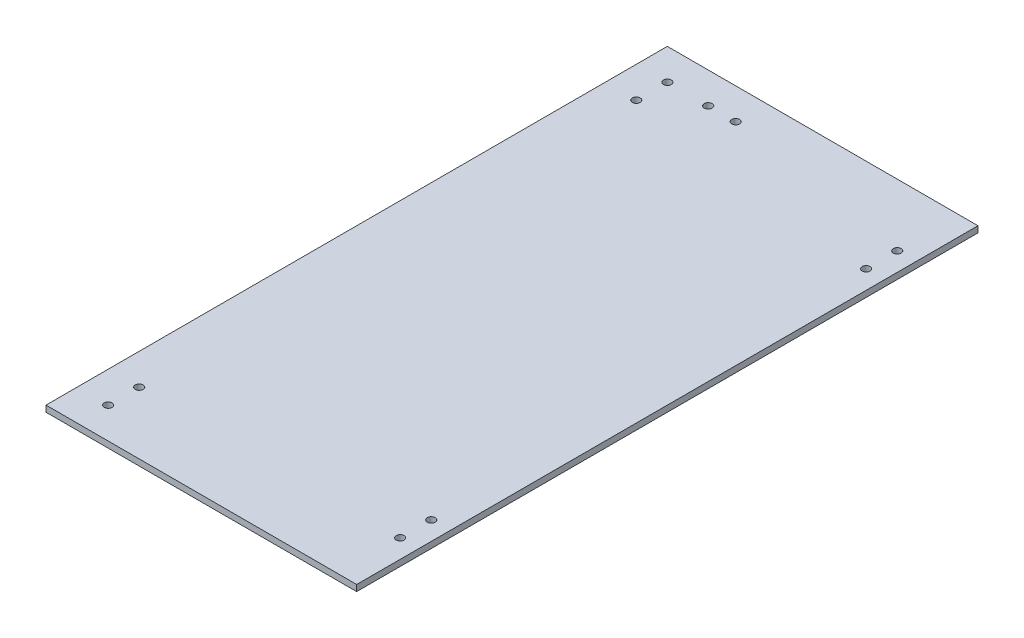
ISO-10303-21;
HEADER;
FILE_DESCRIPTION(('STEP AP214'),'2;1');
FILE_NAME('part.step','',(''),(''),'','','');
FILE_SCHEMA(('AUTOMOTIVE_DESIGN { 1 0 10303 214 1 1 1 1 }'));
ENDSEC;
DATA;
#1=APPLICATION_CONTEXT('core data for automotive mechanical design processes');
#2=APPLICATION_PROTOCOL_DEFINITION('international standard','automotive_design',2000,#1);
#3=PRODUCT_CONTEXT('',#1,'mechanical');
#4=PRODUCT('Part','Part','',(#3));
#5=PRODUCT_RELATED_PRODUCT_CATEGORY('part','',(#4));
#6=PRODUCT_DEFINITION_FORMATION('','',#4);
#7=PRODUCT_DEFINITION_CONTEXT('part definition',#1,'design');
#8=PRODUCT_DEFINITION('design','',#6,#7);
#9=PRODUCT_DEFINITION_SHAPE('','',#8);
#10=(LENGTH_UNIT() NAMED_UNIT(*) SI_UNIT(.MILLI.,.METRE.));
#11=(NAMED_UNIT(*) PLANE_ANGLE_UNIT() SI_UNIT($,.RADIAN.));
#12=(NAMED_UNIT(*) SI_UNIT($,.STERADIAN.) SOLID_ANGLE_UNIT());
#13=UNCERTAINTY_MEASURE_WITH_UNIT(LENGTH_MEASURE(1.E-05),#10,'distance_accuracy_value','');
#14=(GEOMETRIC_REPRESENTATION_CONTEXT(3) GLOBAL_UNCERTAINTY_ASSIGNED_CONTEXT((#13)) GLOBAL_UNIT_ASSIGNED_CONTEXT((#10,
#11,#12)) REPRESENTATION_CONTEXT('',''));
#15=CARTESIAN_POINT('',(0.,0.,0.));
#16=DIRECTION('',(0.,0.,1.));
#17=DIRECTION('',(1.,0.,0.));
#18=AXIS2_PLACEMENT_3D('',#15,#16,#17);
#19=CARTESIAN_POINT('',(0.,5.,-500.));
#20=DIRECTION('',(0.,-1.,0.));
#21=DIRECTION('',(0.,0.,-1.));
#22=AXIS2_PLACEMENT_3D('',#19,#20,#21);
#23=PLANE('',#22);
#24=CARTESIAN_POINT('',(57.902,5.,-475.));
#25=DIRECTION('',(0.,1.,0.));
#26=DIRECTION('',(0.,0.,1.));
#27=AXIS2_PLACEMENT_3D('',#24,#25,#26);
#28=CIRCLE('',#27,3.175);
#29=CARTESIAN_POINT('',(57.902,5.,-471.825));
#30=VERTEX_POINT('',#29);
#31=EDGE_CURVE('E139',#30,#30,#28,.T.);
#32=ORIENTED_EDGE('',*,*,#31,.F.);
#33=EDGE_LOOP('',(#32));
#34=FACE_BOUND('',#33,.T.);
#35=CARTESIAN_POINT('',(80.,5.,-475.));
#36=DIRECTION('',(0.,1.,0.));
#37=DIRECTION('',(0.,0.,1.));
#38=AXIS2_PLACEMENT_3D('',#35,#36,#37);
#39=CIRCLE('',#38,3.175);
#40=CARTESIAN_POINT('',(80.,5.,-471.825));
#41=VERTEX_POINT('',#40);
#42=EDGE_CURVE('E128',#41,#41,#39,.T.);
#43=ORIENTED_EDGE('',*,*,#42,.F.);
#44=EDGE_LOOP('',(#43));
#45=FACE_BOUND('',#44,.T.);
#46=CARTESIAN_POINT('',(235.,5.,-425.));
#47=DIRECTION('',(0.,-1.,0.));
#48=DIRECTION('',(0.,0.,-1.));
#49=AXIS2_PLACEMENT_3D('',#46,#47,#48);
#50=CIRCLE('',#49,3.175);
#51=CARTESIAN_POINT('',(235.,5.,-428.175));
#52=VERTEX_POINT('',#51);
#53=EDGE_CURVE('E159',#52,#52,#50,.F.);
#54=ORIENTED_EDGE('',*,*,#53,.F.);
#55=EDGE_LOOP('',(#54));
#56=FACE_BOUND('',#55,.T.);
#57=CARTESIAN_POINT('',(24.9999999999999,5.,-450.));
#58=DIRECTION('',(0.,1.,0.));
#59=DIRECTION('',(0.,0.,1.));
#60=AXIS2_PLACEMENT_3D('',#57,#58,#59);
#61=CIRCLE('',#60,3.175);
#62=CARTESIAN_POINT('',(24.9999999999999,5.,-446.825));
#63=VERTEX_POINT('',#62);
#64=EDGE_CURVE('E124',#63,#63,#61,.T.);
#65=ORIENTED_EDGE('',*,*,#64,.F.);
#66=EDGE_LOOP('',(#65));
#67=FACE_BOUND('',#66,.T.);
#68=CARTESIAN_POINT('',(25.,5.,-475.));
#69=DIRECTION('',(0.,1.,0.));
#70=DIRECTION('',(0.,0.,1.));
#71=AXIS2_PLACEMENT_3D('',#68,#69,#70);
#72=CIRCLE('',#71,3.175);
#73=CARTESIAN_POINT('',(25.,5.,-471.825));
#74=VERTEX_POINT('',#73);
#75=EDGE_CURVE('E121',#74,#74,#72,.T.);
#76=ORIENTED_EDGE('',*,*,#75,.F.);
#77=EDGE_LOOP('',(#76));
#78=FACE_BOUND('',#77,.T.);
#79=CARTESIAN_POINT('',(25.0000000000001,5.,-50.));
#80=DIRECTION('',(0.,1.,0.));
#81=DIRECTION('',(0.,0.,1.));
#82=AXIS2_PLACEMENT_3D('',#79,#80,#81);
#83=CIRCLE('',#82,3.175);
#84=CARTESIAN_POINT('',(25.0000000000001,5.,-46.825));
#85=VERTEX_POINT('',#84);
#86=EDGE_CURVE('E117',#85,#85,#83,.T.);
#87=ORIENTED_EDGE('',*,*,#86,.F.);
#88=EDGE_LOOP('',(#87));
#89=FACE_BOUND('',#88,.T.);
#90=CARTESIAN_POINT('',(25.,5.,-25.));
#91=DIRECTION('',(0.,1.,0.));
#92=DIRECTION('',(0.,0.,1.));
#93=AXIS2_PLACEMENT_3D('',#90,#91,#92);
#94=CIRCLE('',#93,3.175);
#95=CARTESIAN_POINT('',(25.,5.,-21.825));
#96=VERTEX_POINT('',#95);
#97=EDGE_CURVE('E113',#96,#96,#94,.T.);
#98=ORIENTED_EDGE('',*,*,#97,.F.);
#99=EDGE_LOOP('',(#98));
#100=FACE_BOUND('',#99,.T.);
#101=DIRECTION('',(0.,0.,1.));
#102=VECTOR('',#101,1.);
#103=CARTESIAN_POINT('',(0.,5.,0.));
#104=LINE('',#103,#102);
#105=CARTESIAN_POINT('',(0.,5.,-500.));
#106=VERTEX_POINT('',#105);
#107=CARTESIAN_POINT('',(0.,5.,0.));
#108=VERTEX_POINT('',#107);
#109=EDGE_CURVE('E89',#106,#108,#104,.T.);
#110=ORIENTED_EDGE('',*,*,#109,.T.);
#111=DIRECTION('',(1.,0.,0.));
#112=VECTOR('',#111,1.);
#113=CARTESIAN_POINT('',(0.,5.,0.));
#114=LINE('',#113,#112);
#115=CARTESIAN_POINT('',(250.,5.,0.));
#116=VERTEX_POINT('',#115);
#117=EDGE_CURVE('E84',#108,#116,#114,.T.);
#118=ORIENTED_EDGE('',*,*,#117,.T.);
#119=DIRECTION('',(0.,0.,-1.));
#120=VECTOR('',#119,1.);
#121=CARTESIAN_POINT('',(250.,5.,0.));
#122=LINE('',#121,#120);
#123=CARTESIAN_POINT('',(250.,5.,-500.));
#124=VERTEX_POINT('',#123);
#125=EDGE_CURVE('E87',#116,#124,#122,.T.);
#126=ORIENTED_EDGE('',*,*,#125,.T.);
#127=DIRECTION('',(-1.,0.,0.));
#128=VECTOR('',#127,1.);
#129=CARTESIAN_POINT('',(0.,5.,-500.));
#130=LINE('',#129,#128);
#131=EDGE_CURVE('E54',#124,#106,#130,.T.);
#132=ORIENTED_EDGE('',*,*,#131,.T.);
#133=EDGE_LOOP('',(#110,#118,#126,#132));
#134=FACE_BOUND('',#133,.T.);
#135=CARTESIAN_POINT('',(235.,5.,-50.));
#136=DIRECTION('',(0.,-1.,0.));
#137=DIRECTION('',(0.,0.,-1.));
#138=AXIS2_PLACEMENT_3D('',#135,#136,#137);
#139=CIRCLE('',#138,3.17499999999991);
#140=CARTESIAN_POINT('',(235.,5.,-53.1749999999999));
#141=VERTEX_POINT('',#140);
#142=EDGE_CURVE('E153',#141,#141,#139,.T.);
#143=ORIENTED_EDGE('',*,*,#142,.T.);
#144=EDGE_LOOP('',(#143));
#145=FACE_BOUND('',#144,.T.);
#146=CARTESIAN_POINT('',(235.,5.,-75.));
#147=DIRECTION('',(0.,-1.,0.));
#148=DIRECTION('',(0.,0.,-1.));
#149=AXIS2_PLACEMENT_3D('',#146,#147,#148);
#150=CIRCLE('',#149,3.17499999999991);
#151=CARTESIAN_POINT('',(235.,5.,-78.1749999999999));
#152=VERTEX_POINT('',#151);
#153=EDGE_CURVE('E147',#152,#152,#150,.T.);
#154=ORIENTED_EDGE('',*,*,#153,.T.);
#155=EDGE_LOOP('',(#154));
#156=FACE_BOUND('',#155,.T.);
#157=CARTESIAN_POINT('',(235.,5.,-450.));
#158=DIRECTION('',(0.,-1.,0.));
#159=DIRECTION('',(0.,0.,-1.));
#160=AXIS2_PLACEMENT_3D('',#157,#158,#159);
#161=CIRCLE('',#160,3.17499999999994);
#162=CARTESIAN_POINT('',(235.,5.,-453.175));
#163=VERTEX_POINT('',#162);
#164=EDGE_CURVE('E132',#163,#163,#161,.F.);
#165=ORIENTED_EDGE('',*,*,#164,.F.);
#166=EDGE_LOOP('',(#165));
#167=FACE_BOUND('',#166,.T.);
#168=ADVANCED_FACE('F35',(#34,#45,#56,#67,#78,#89,#100,#134,#145,#156,#167),#23,.F.);
#169=CARTESIAN_POINT('',(0.,0.,-500.));
#170=DIRECTION('',(0.,-1.,0.));
#171=DIRECTION('',(0.,0.,-1.));
#172=AXIS2_PLACEMENT_3D('',#169,#170,#171);
#173=PLANE('',#172);
#174=CARTESIAN_POINT('',(57.902,0.,-475.));
#175=DIRECTION('',(0.,-1.,0.));
#176=DIRECTION('',(0.,0.,-1.));
#177=AXIS2_PLACEMENT_3D('',#174,#175,#176);
#178=CIRCLE('',#177,3.175);
#179=CARTESIAN_POINT('',(57.902,0.,-478.175));
#180=VERTEX_POINT('',#179);
#181=EDGE_CURVE('E39',#180,#180,#178,.T.);
#182=ORIENTED_EDGE('',*,*,#181,.F.);
#183=EDGE_LOOP('',(#182));
#184=FACE_BOUND('',#183,.T.);
#185=CARTESIAN_POINT('',(80.,0.,-475.));
#186=DIRECTION('',(0.,-1.,0.));
#187=DIRECTION('',(0.,0.,-1.));
#188=AXIS2_PLACEMENT_3D('',#185,#186,#187);
#189=CIRCLE('',#188,3.175);
#190=CARTESIAN_POINT('',(80.,0.,-478.175));
#191=VERTEX_POINT('',#190);
#192=EDGE_CURVE('E125',#191,#191,#189,.T.);
#193=ORIENTED_EDGE('',*,*,#192,.F.);
#194=EDGE_LOOP('',(#193));
#195=FACE_BOUND('',#194,.T.);
#196=CARTESIAN_POINT('',(235.,0.,-425.));
#197=DIRECTION('',(0.,-1.,0.));
#198=DIRECTION('',(0.,0.,-1.));
#199=AXIS2_PLACEMENT_3D('',#196,#197,#198);
#200=CIRCLE('',#199,3.175);
#201=CARTESIAN_POINT('',(235.,0.,-428.175));
#202=VERTEX_POINT('',#201);
#203=EDGE_CURVE('E156',#202,#202,#200,.F.);
#204=ORIENTED_EDGE('',*,*,#203,.T.);
#205=EDGE_LOOP('',(#204));
#206=FACE_BOUND('',#205,.T.);
#207=CARTESIAN_POINT('',(24.9999999999999,0.,-450.));
#208=DIRECTION('',(0.,-1.,0.));
#209=DIRECTION('',(0.,0.,-1.));
#210=AXIS2_PLACEMENT_3D('',#207,#208,#209);
#211=CIRCLE('',#210,3.175);
#212=CARTESIAN_POINT('',(24.9999999999999,0.,-453.175));
#213=VERTEX_POINT('',#212);
#214=EDGE_CURVE('E122',#213,#213,#211,.T.);
#215=ORIENTED_EDGE('',*,*,#214,.F.);
#216=EDGE_LOOP('',(#215));
#217=FACE_BOUND('',#216,.T.);
#218=CARTESIAN_POINT('',(25.,0.,-475.));
#219=DIRECTION('',(0.,-1.,0.));
#220=DIRECTION('',(0.,0.,-1.));
#221=AXIS2_PLACEMENT_3D('',#218,#219,#220);
#222=CIRCLE('',#221,3.175);
#223=CARTESIAN_POINT('',(25.,0.,-478.175));
#224=VERTEX_POINT('',#223);
#225=EDGE_CURVE('E118',#224,#224,#222,.T.);
#226=ORIENTED_EDGE('',*,*,#225,.F.);
#227=EDGE_LOOP('',(#226));
#228=FACE_BOUND('',#227,.T.);
#229=CARTESIAN_POINT('',(25.0000000000001,0.,-50.));
#230=DIRECTION('',(0.,-1.,0.));
#231=DIRECTION('',(0.,0.,-1.));
#232=AXIS2_PLACEMENT_3D('',#229,#230,#231);
#233=CIRCLE('',#232,3.175);
#234=CARTESIAN_POINT('',(25.0000000000001,0.,-53.175));
#235=VERTEX_POINT('',#234);
#236=EDGE_CURVE('E114',#235,#235,#233,.T.);
#237=ORIENTED_EDGE('',*,*,#236,.F.);
#238=EDGE_LOOP('',(#237));
#239=FACE_BOUND('',#238,.T.);
#240=CARTESIAN_POINT('',(25.,0.,-25.));
#241=DIRECTION('',(0.,-1.,0.));
#242=DIRECTION('',(0.,0.,-1.));
#243=AXIS2_PLACEMENT_3D('',#240,#241,#242);
#244=CIRCLE('',#243,3.175);
#245=CARTESIAN_POINT('',(25.,0.,-28.175));
#246=VERTEX_POINT('',#245);
#247=EDGE_CURVE('E105',#246,#246,#244,.T.);
#248=ORIENTED_EDGE('',*,*,#247,.F.);
#249=EDGE_LOOP('',(#248));
#250=FACE_BOUND('',#249,.T.);
#251=DIRECTION('',(0.,0.,1.));
#252=VECTOR('',#251,1.);
#253=CARTESIAN_POINT('',(0.,0.,0.));
#254=LINE('',#253,#252);
#255=CARTESIAN_POINT('',(0.,0.,-500.));
#256=VERTEX_POINT('',#255);
#257=CARTESIAN_POINT('',(0.,0.,0.));
#258=VERTEX_POINT('',#257);
#259=EDGE_CURVE('E102',#256,#258,#254,.T.);
#260=ORIENTED_EDGE('',*,*,#259,.F.);
#261=DIRECTION('',(-1.,0.,0.));
#262=VECTOR('',#261,1.);
#263=CARTESIAN_POINT('',(0.,0.,-500.));
#264=LINE('',#263,#262);
#265=CARTESIAN_POINT('',(250.,0.,-500.));
#266=VERTEX_POINT('',#265);
#267=EDGE_CURVE('E77',#266,#256,#264,.T.);
#268=ORIENTED_EDGE('',*,*,#267,.F.);
#269=DIRECTION('',(0.,0.,-1.));
#270=VECTOR('',#269,1.);
#271=CARTESIAN_POINT('',(250.,0.,0.));
#272=LINE('',#271,#270);
#273=CARTESIAN_POINT('',(250.,0.,0.));
#274=VERTEX_POINT('',#273);
#275=EDGE_CURVE('E71',#274,#266,#272,.T.);
#276=ORIENTED_EDGE('',*,*,#275,.F.);
#277=DIRECTION('',(1.,0.,0.));
#278=VECTOR('',#277,1.);
#279=CARTESIAN_POINT('',(0.,0.,0.));
#280=LINE('',#279,#278);
#281=EDGE_CURVE('E93',#258,#274,#280,.T.);
#282=ORIENTED_EDGE('',*,*,#281,.F.);
#283=EDGE_LOOP('',(#260,#268,#276,#282));
#284=FACE_BOUND('',#283,.T.);
#285=CARTESIAN_POINT('',(235.,0.,-50.));
#286=DIRECTION('',(0.,-1.,0.));
#287=DIRECTION('',(0.,0.,-1.));
#288=AXIS2_PLACEMENT_3D('',#285,#286,#287);
#289=CIRCLE('',#288,3.17499999999991);
#290=CARTESIAN_POINT('',(235.,0.,-53.1749999999999));
#291=VERTEX_POINT('',#290);
#292=EDGE_CURVE('E150',#291,#291,#289,.T.);
#293=ORIENTED_EDGE('',*,*,#292,.F.);
#294=EDGE_LOOP('',(#293));
#295=FACE_BOUND('',#294,.T.);
#296=CARTESIAN_POINT('',(235.,0.,-75.));
#297=DIRECTION('',(0.,-1.,0.));
#298=DIRECTION('',(0.,0.,-1.));
#299=AXIS2_PLACEMENT_3D('',#296,#297,#298);
#300=CIRCLE('',#299,3.17499999999991);
#301=CARTESIAN_POINT('',(235.,0.,-78.1749999999999));
#302=VERTEX_POINT('',#301);
#303=EDGE_CURVE('E144',#302,#302,#300,.T.);
#304=ORIENTED_EDGE('',*,*,#303,.F.);
#305=EDGE_LOOP('',(#304));
#306=FACE_BOUND('',#305,.T.);
#307=CARTESIAN_POINT('',(235.,0.,-450.));
#308=DIRECTION('',(0.,1.,0.));
#309=DIRECTION('',(0.,0.,1.));
#310=AXIS2_PLACEMENT_3D('',#307,#308,#309);
#311=CIRCLE('',#310,3.17499999999994);
#312=CARTESIAN_POINT('',(235.,0.,-453.175));
#313=VERTEX_POINT('',#312);
#314=EDGE_CURVE('E127',#313,#313,#311,.T.);
#315=ORIENTED_EDGE('',*,*,#314,.T.);
#316=EDGE_LOOP('',(#315));
#317=FACE_BOUND('',#316,.T.);
#318=ADVANCED_FACE('F174',(#184,#195,#206,#217,#228,#239,#250,#284,#295,#306,#317),#173,.T.);
#319=CARTESIAN_POINT('',(0.,5.,0.));
#320=DIRECTION('',(1.,0.,0.));
#321=DIRECTION('',(0.,0.,-1.));
#322=AXIS2_PLACEMENT_3D('',#319,#320,#321);
#323=PLANE('',#322);
#324=ORIENTED_EDGE('',*,*,#259,.T.);
#325=DIRECTION('',(0.,-1.,0.));
#326=VECTOR('',#325,1.);
#327=CARTESIAN_POINT('',(0.,5.,0.));
#328=LINE('',#327,#326);
#329=EDGE_CURVE('E11',#108,#258,#328,.T.);
#330=ORIENTED_EDGE('',*,*,#329,.F.);
#331=ORIENTED_EDGE('',*,*,#109,.F.);
#332=DIRECTION('',(0.,-1.,0.));
#333=VECTOR('',#332,1.);
#334=CARTESIAN_POINT('',(0.,5.,-500.));
#335=LINE('',#334,#333);
#336=EDGE_CURVE('E98',#106,#256,#335,.T.);
#337=ORIENTED_EDGE('',*,*,#336,.T.);
#338=EDGE_LOOP('',(#324,#330,#331,#337));
#339=FACE_BOUND('',#338,.T.);
#340=ADVANCED_FACE('F37',(#339),#323,.F.);
#341=CARTESIAN_POINT('',(0.,5.,0.));
#342=DIRECTION('',(0.,0.,-1.));
#343=DIRECTION('',(-1.,0.,0.));
#344=AXIS2_PLACEMENT_3D('',#341,#342,#343);
#345=PLANE('',#344);
#346=ORIENTED_EDGE('',*,*,#281,.T.);
#347=DIRECTION('',(0.,-1.,0.));
#348=VECTOR('',#347,1.);
#349=CARTESIAN_POINT('',(250.,5.,0.));
#350=LINE('',#349,#348);
#351=EDGE_CURVE('E45',#116,#274,#350,.T.);
#352=ORIENTED_EDGE('',*,*,#351,.F.);
#353=ORIENTED_EDGE('',*,*,#117,.F.);
#354=ORIENTED_EDGE('',*,*,#329,.T.);
#355=EDGE_LOOP('',(#346,#352,#353,#354));
#356=FACE_BOUND('',#355,.T.);
#357=ADVANCED_FACE('F92',(#356),#345,.F.);
#358=CARTESIAN_POINT('',(250.,5.,0.));
#359=DIRECTION('',(-1.,0.,0.));
#360=DIRECTION('',(0.,0.,1.));
#361=AXIS2_PLACEMENT_3D('',#358,#359,#360);
#362=PLANE('',#361);
#363=ORIENTED_EDGE('',*,*,#275,.T.);
#364=DIRECTION('',(0.,-1.,0.));
#365=VECTOR('',#364,1.);
#366=CARTESIAN_POINT('',(250.,5.,-500.));
#367=LINE('',#366,#365);
#368=EDGE_CURVE('E94',#124,#266,#367,.T.);
#369=ORIENTED_EDGE('',*,*,#368,.F.);
#370=ORIENTED_EDGE('',*,*,#125,.F.);
#371=ORIENTED_EDGE('',*,*,#351,.T.);
#372=EDGE_LOOP('',(#363,#369,#370,#371));
#373=FACE_BOUND('',#372,.T.);
#374=ADVANCED_FACE('F96',(#373),#362,.F.);
#375=CARTESIAN_POINT('',(0.,5.,-500.));
#376=DIRECTION('',(0.,0.,1.));
#377=DIRECTION('',(1.,0.,0.));
#378=AXIS2_PLACEMENT_3D('',#375,#376,#377);
#379=PLANE('',#378);
#380=ORIENTED_EDGE('',*,*,#267,.T.);
#381=ORIENTED_EDGE('',*,*,#336,.F.);
#382=ORIENTED_EDGE('',*,*,#131,.F.);
#383=ORIENTED_EDGE('',*,*,#368,.T.);
#384=EDGE_LOOP('',(#380,#381,#382,#383));
#385=FACE_BOUND('',#384,.T.);
#386=ADVANCED_FACE('F188',(#385),#379,.F.);
#387=CARTESIAN_POINT('',(25.,-5.,-25.));
#388=DIRECTION('',(0.,1.,0.));
#389=DIRECTION('',(0.,0.,1.));
#390=AXIS2_PLACEMENT_3D('',#387,#388,#389);
#391=CYLINDRICAL_SURFACE('',#390,3.175);
#392=ORIENTED_EDGE('',*,*,#247,.T.);
#393=EDGE_LOOP('',(#392));
#394=FACE_BOUND('',#393,.T.);
#395=ORIENTED_EDGE('',*,*,#97,.T.);
#396=EDGE_LOOP('',(#395));
#397=FACE_BOUND('',#396,.T.);
#398=ADVANCED_FACE('F171',(#394,#397),#391,.F.);
#399=CARTESIAN_POINT('',(25.0000000000001,-5.,-50.));
#400=DIRECTION('',(0.,1.,0.));
#401=DIRECTION('',(0.,0.,1.));
#402=AXIS2_PLACEMENT_3D('',#399,#400,#401);
#403=CYLINDRICAL_SURFACE('',#402,3.175);
#404=ORIENTED_EDGE('',*,*,#236,.T.);
#405=EDGE_LOOP('',(#404));
#406=FACE_BOUND('',#405,.T.);
#407=ORIENTED_EDGE('',*,*,#86,.T.);
#408=EDGE_LOOP('',(#407));
#409=FACE_BOUND('',#408,.T.);
#410=ADVANCED_FACE('F240',(#406,#409),#403,.F.);
#411=CARTESIAN_POINT('',(25.,-5.,-475.));
#412=DIRECTION('',(0.,1.,0.));
#413=DIRECTION('',(0.,0.,1.));
#414=AXIS2_PLACEMENT_3D('',#411,#412,#413);
#415=CYLINDRICAL_SURFACE('',#414,3.175);
#416=ORIENTED_EDGE('',*,*,#225,.T.);
#417=EDGE_LOOP('',(#416));
#418=FACE_BOUND('',#417,.T.);
#419=ORIENTED_EDGE('',*,*,#75,.T.);
#420=EDGE_LOOP('',(#419));
#421=FACE_BOUND('',#420,.T.);
#422=ADVANCED_FACE('F237',(#418,#421),#415,.F.);
#423=CARTESIAN_POINT('',(24.9999999999999,-5.,-450.));
#424=DIRECTION('',(0.,1.,0.));
#425=DIRECTION('',(0.,0.,1.));
#426=AXIS2_PLACEMENT_3D('',#423,#424,#425);
#427=CYLINDRICAL_SURFACE('',#426,3.175);
#428=ORIENTED_EDGE('',*,*,#214,.T.);
#429=EDGE_LOOP('',(#428));
#430=FACE_BOUND('',#429,.T.);
#431=ORIENTED_EDGE('',*,*,#64,.T.);
#432=EDGE_LOOP('',(#431));
#433=FACE_BOUND('',#432,.T.);
#434=ADVANCED_FACE('F233',(#430,#433),#427,.F.);
#435=CARTESIAN_POINT('',(235.,9.99999999999999,-425.));
#436=DIRECTION('',(0.,-1.,0.));
#437=DIRECTION('',(0.,0.,-1.));
#438=AXIS2_PLACEMENT_3D('',#435,#436,#437);
#439=CYLINDRICAL_SURFACE('',#438,3.175);
#440=CARTESIAN_POINT('',(235.,0.,-428.175));
#441=CARTESIAN_POINT('',(235.,0.0520833333333351,-428.175));
#442=CARTESIAN_POINT('',(235.,0.104166666666669,-428.175));
#443=CARTESIAN_POINT('',(235.,0.208333333333335,-428.175));
#444=CARTESIAN_POINT('',(235.,0.260416666666669,-428.175));
#445=CARTESIAN_POINT('',(235.,0.364583333333335,-428.175));
#446=CARTESIAN_POINT('',(235.,0.416666666666669,-428.175));
#447=CARTESIAN_POINT('',(235.,0.520833333333335,-428.175));
#448=CARTESIAN_POINT('',(235.,0.572916666666669,-428.175));
#449=CARTESIAN_POINT('',(235.,0.677083333333336,-428.175));
#450=CARTESIAN_POINT('',(235.,0.729166666666669,-428.175));
#451=CARTESIAN_POINT('',(235.,0.833333333333335,-428.175));
#452=CARTESIAN_POINT('',(235.,0.885416666666668,-428.175));
#453=CARTESIAN_POINT('',(235.,0.989583333333334,-428.175));
#454=CARTESIAN_POINT('',(235.,1.04166666666667,-428.175));
#455=CARTESIAN_POINT('',(235.,1.14583333333333,-428.175));
#456=CARTESIAN_POINT('',(235.,1.19791666666667,-428.175));
#457=CARTESIAN_POINT('',(235.,1.30208333333333,-428.175));
#458=CARTESIAN_POINT('',(235.,1.35416666666667,-428.175));
#459=CARTESIAN_POINT('',(235.,1.45833333333333,-428.175));
#460=CARTESIAN_POINT('',(235.,1.51041666666667,-428.175));
#461=CARTESIAN_POINT('',(235.,1.61458333333333,-428.175));
#462=CARTESIAN_POINT('',(235.,1.66666666666667,-428.175));
#463=CARTESIAN_POINT('',(235.,1.77083333333334,-428.175));
#464=CARTESIAN_POINT('',(235.,1.82291666666667,-428.175));
#465=CARTESIAN_POINT('',(235.,1.92708333333334,-428.175));
#466=CARTESIAN_POINT('',(235.,1.97916666666667,-428.175));
#467=CARTESIAN_POINT('',(235.,2.08333333333334,-428.175));
#468=CARTESIAN_POINT('',(235.,2.13541666666667,-428.175));
#469=CARTESIAN_POINT('',(235.,2.23958333333333,-428.175));
#470=CARTESIAN_POINT('',(235.,2.29166666666667,-428.175));
#471=CARTESIAN_POINT('',(235.,2.39583333333333,-428.175));
#472=CARTESIAN_POINT('',(235.,2.44791666666667,-428.175));
#473=CARTESIAN_POINT('',(235.,2.55208333333333,-428.175));
#474=CARTESIAN_POINT('',(235.,2.60416666666667,-428.175));
#475=CARTESIAN_POINT('',(235.,2.70833333333333,-428.175));
#476=CARTESIAN_POINT('',(235.,2.76041666666667,-428.175));
#477=CARTESIAN_POINT('',(235.,2.86458333333333,-428.175));
#478=CARTESIAN_POINT('',(235.,2.91666666666667,-428.175));
#479=CARTESIAN_POINT('',(235.,3.02083333333333,-428.175));
#480=CARTESIAN_POINT('',(235.,3.07291666666667,-428.175));
#481=CARTESIAN_POINT('',(235.,3.17708333333333,-428.175));
#482=CARTESIAN_POINT('',(235.,3.22916666666667,-428.175));
#483=CARTESIAN_POINT('',(235.,3.33333333333333,-428.175));
#484=CARTESIAN_POINT('',(235.,3.38541666666667,-428.175));
#485=CARTESIAN_POINT('',(235.,3.48958333333333,-428.175));
#486=CARTESIAN_POINT('',(235.,3.54166666666667,-428.175));
#487=CARTESIAN_POINT('',(235.,3.64583333333333,-428.175));
#488=CARTESIAN_POINT('',(235.,3.69791666666667,-428.175));
#489=CARTESIAN_POINT('',(235.,3.80208333333333,-428.175));
#490=CARTESIAN_POINT('',(235.,3.85416666666667,-428.175));
#491=CARTESIAN_POINT('',(235.,3.95833333333333,-428.175));
#492=CARTESIAN_POINT('',(235.,4.01041666666667,-428.175));
#493=CARTESIAN_POINT('',(235.,4.11458333333333,-428.175));
#494=CARTESIAN_POINT('',(235.,4.16666666666667,-428.175));
#495=CARTESIAN_POINT('',(235.,4.27083333333333,-428.175));
#496=CARTESIAN_POINT('',(235.,4.32291666666667,-428.175));
#497=CARTESIAN_POINT('',(235.,4.42708333333333,-428.175));
#498=CARTESIAN_POINT('',(235.,4.47916666666667,-428.175));
#499=CARTESIAN_POINT('',(235.,4.58333333333333,-428.175));
#500=CARTESIAN_POINT('',(235.,4.63541666666667,-428.175));
#501=CARTESIAN_POINT('',(235.,4.73958333333333,-428.175));
#502=CARTESIAN_POINT('',(235.,4.79166666666667,-428.175));
#503=CARTESIAN_POINT('',(235.,4.89583333333333,-428.175));
#504=CARTESIAN_POINT('',(235.,4.94791666666667,-428.175));
#505=CARTESIAN_POINT('',(235.,5.,-428.175));
#506=B_SPLINE_CURVE_WITH_KNOTS('',3,(#440,#441,#442,#443,#444,#445,#446,#447,#448,#449,#450,
#451,#452,#453,#454,#455,#456,#457,#458,#459,#460,#461,#462,#463,#464,#465,#466,#467,#468,#469,
#470,#471,#472,#473,#474,#475,#476,#477,#478,#479,#480,#481,#482,#483,#484,#485,#486,#487,#488,
#489,#490,#491,#492,#493,#494,#495,#496,#497,#498,#499,#500,#501,#502,#503,#504,#505),
.UNSPECIFIED.,.F.,.F.,(4,2,2,2,2,2,2,2,2,2,2,2,2,2,2,2,2,2,2,2,2,2,2,2,2,2,2,2,2,2,2,2,4),(0.,
0.15625,0.3125,0.46875,0.625000000000001,0.781250000000001,0.937499999999999,1.09375,1.25,
1.40625,1.5625,1.71875,1.875,2.03125,2.1875,2.34375,2.5,2.65625,2.8125,2.96875,3.125,3.28125,
3.4375,3.59375,3.75,3.90625,4.0625,4.21875,4.375,4.53125,4.6875,4.84375,5.),.UNSPECIFIED.);
#507=EDGE_CURVE('BSEAM229',#202,#52,#506,.T.);
#508=ORIENTED_EDGE('',*,*,#203,.F.);
#509=ORIENTED_EDGE('',*,*,#53,.T.);
#510=ORIENTED_EDGE('',*,*,#507,.T.);
#511=ORIENTED_EDGE('',*,*,#507,.F.);
#512=EDGE_LOOP('',(#508,#510,#509,#511));
#513=FACE_BOUND('',#512,.T.);
#514=ADVANCED_FACE('F229',(#513),#439,.F.);
#515=CARTESIAN_POINT('',(235.,9.99999999999999,-50.));
#516=DIRECTION('',(0.,-1.,0.));
#517=DIRECTION('',(0.,0.,-1.));
#518=AXIS2_PLACEMENT_3D('',#515,#516,#517);
#519=CYLINDRICAL_SURFACE('',#518,3.17499999999991);
#520=CARTESIAN_POINT('',(235.,0.,-53.1749999999999));
#521=CARTESIAN_POINT('',(235.,0.0520833333333351,-53.1749999999999));
#522=CARTESIAN_POINT('',(235.,0.104166666666669,-53.1749999999999));
#523=CARTESIAN_POINT('',(235.,0.208333333333335,-53.1749999999999));
#524=CARTESIAN_POINT('',(235.,0.260416666666669,-53.1749999999999));
#525=CARTESIAN_POINT('',(235.,0.364583333333335,-53.1749999999999));
#526=CARTESIAN_POINT('',(235.,0.416666666666669,-53.1749999999999));
#527=CARTESIAN_POINT('',(235.,0.520833333333335,-53.1749999999999));
#528=CARTESIAN_POINT('',(235.,0.572916666666669,-53.1749999999999));
#529=CARTESIAN_POINT('',(235.,0.677083333333336,-53.1749999999999));
#530=CARTESIAN_POINT('',(235.,0.729166666666669,-53.1749999999999));
#531=CARTESIAN_POINT('',(235.,0.833333333333335,-53.1749999999999));
#532=CARTESIAN_POINT('',(235.,0.885416666666668,-53.1749999999999));
#533=CARTESIAN_POINT('',(235.,0.989583333333334,-53.1749999999999));
#534=CARTESIAN_POINT('',(235.,1.04166666666667,-53.1749999999999));
#535=CARTESIAN_POINT('',(235.,1.14583333333333,-53.1749999999999));
#536=CARTESIAN_POINT('',(235.,1.19791666666667,-53.1749999999999));
#537=CARTESIAN_POINT('',(235.,1.30208333333333,-53.1749999999999));
#538=CARTESIAN_POINT('',(235.,1.35416666666667,-53.1749999999999));
#539=CARTESIAN_POINT('',(235.,1.45833333333333,-53.1749999999999));
#540=CARTESIAN_POINT('',(235.,1.51041666666667,-53.1749999999999));
#541=CARTESIAN_POINT('',(235.,1.61458333333333,-53.1749999999999));
#542=CARTESIAN_POINT('',(235.,1.66666666666667,-53.1749999999999));
#543=CARTESIAN_POINT('',(235.,1.77083333333334,-53.1749999999999));
#544=CARTESIAN_POINT('',(235.,1.82291666666667,-53.1749999999999));
#545=CARTESIAN_POINT('',(235.,1.92708333333334,-53.1749999999999));
#546=CARTESIAN_POINT('',(235.,1.97916666666667,-53.1749999999999));
#547=CARTESIAN_POINT('',(235.,2.08333333333334,-53.1749999999999));
#548=CARTESIAN_POINT('',(235.,2.13541666666667,-53.1749999999999));
#549=CARTESIAN_POINT('',(235.,2.23958333333333,-53.1749999999999));
#550=CARTESIAN_POINT('',(235.,2.29166666666667,-53.1749999999999));
#551=CARTESIAN_POINT('',(235.,2.39583333333333,-53.1749999999999));
#552=CARTESIAN_POINT('',(235.,2.44791666666667,-53.1749999999999));
#553=CARTESIAN_POINT('',(235.,2.55208333333333,-53.1749999999999));
#554=CARTESIAN_POINT('',(235.,2.60416666666667,-53.1749999999999));
#555=CARTESIAN_POINT('',(235.,2.70833333333333,-53.1749999999999));
#556=CARTESIAN_POINT('',(235.,2.76041666666667,-53.1749999999999));
#557=CARTESIAN_POINT('',(235.,2.86458333333333,-53.1749999999999));
#558=CARTESIAN_POINT('',(235.,2.91666666666667,-53.1749999999999));
#559=CARTESIAN_POINT('',(235.,3.02083333333333,-53.1749999999999));
#560=CARTESIAN_POINT('',(235.,3.07291666666667,-53.1749999999999));
#561=CARTESIAN_POINT('',(235.,3.17708333333333,-53.1749999999999));
#562=CARTESIAN_POINT('',(235.,3.22916666666667,-53.1749999999999));
#563=CARTESIAN_POINT('',(235.,3.33333333333333,-53.1749999999999));
#564=CARTESIAN_POINT('',(235.,3.38541666666667,-53.1749999999999));
#565=CARTESIAN_POINT('',(235.,3.48958333333333,-53.1749999999999));
#566=CARTESIAN_POINT('',(235.,3.54166666666667,-53.1749999999999));
#567=CARTESIAN_POINT('',(235.,3.64583333333333,-53.1749999999999));
#568=CARTESIAN_POINT('',(235.,3.69791666666667,-53.1749999999999));
#569=CARTESIAN_POINT('',(235.,3.80208333333333,-53.1749999999999));
#570=CARTESIAN_POINT('',(235.,3.85416666666667,-53.1749999999999));
#571=CARTESIAN_POINT('',(235.,3.95833333333333,-53.1749999999999));
#572=CARTESIAN_POINT('',(235.,4.01041666666667,-53.1749999999999));
#573=CARTESIAN_POINT('',(235.,4.11458333333333,-53.1749999999999));
#574=CARTESIAN_POINT('',(235.,4.16666666666667,-53.1749999999999));
#575=CARTESIAN_POINT('',(235.,4.27083333333333,-53.1749999999999));
#576=CARTESIAN_POINT('',(235.,4.32291666666667,-53.1749999999999));
#577=CARTESIAN_POINT('',(235.,4.42708333333333,-53.1749999999999));
#578=CARTESIAN_POINT('',(235.,4.47916666666667,-53.1749999999999));
#579=CARTESIAN_POINT('',(235.,4.58333333333333,-53.1749999999999));
#580=CARTESIAN_POINT('',(235.,4.63541666666667,-53.1749999999999));
#581=CARTESIAN_POINT('',(235.,4.73958333333333,-53.1749999999999));
#582=CARTESIAN_POINT('',(235.,4.79166666666667,-53.1749999999999));
#583=CARTESIAN_POINT('',(235.,4.89583333333333,-53.1749999999999));
#584=CARTESIAN_POINT('',(235.,4.94791666666667,-53.1749999999999));
#585=CARTESIAN_POINT('',(235.,5.,-53.1749999999999));
#586=B_SPLINE_CURVE_WITH_KNOTS('',3,(#520,#521,#522,#523,#524,#525,#526,#527,#528,#529,#530,
#531,#532,#533,#534,#535,#536,#537,#538,#539,#540,#541,#542,#543,#544,#545,#546,#547,#548,#549,
#550,#551,#552,#553,#554,#555,#556,#557,#558,#559,#560,#561,#562,#563,#564,#565,#566,#567,#568,
#569,#570,#571,#572,#573,#574,#575,#576,#577,#578,#579,#580,#581,#582,#583,#584,#585),
.UNSPECIFIED.,.F.,.F.,(4,2,2,2,2,2,2,2,2,2,2,2,2,2,2,2,2,2,2,2,2,2,2,2,2,2,2,2,2,2,2,2,4),(0.,
0.15625,0.3125,0.46875,0.625000000000001,0.781250000000001,0.937499999999999,1.09375,1.25,
1.40625,1.5625,1.71875,1.875,2.03125,2.1875,2.34375,2.5,2.65625,2.8125,2.96875,3.125,3.28125,
3.4375,3.59375,3.75,3.90625,4.0625,4.21875,4.375,4.53125,4.6875,4.84375,5.),.UNSPECIFIED.);
#587=EDGE_CURVE('BSEAM222',#291,#141,#586,.T.);
#588=ORIENTED_EDGE('',*,*,#292,.T.);
#589=ORIENTED_EDGE('',*,*,#142,.F.);
#590=ORIENTED_EDGE('',*,*,#587,.T.);
#591=ORIENTED_EDGE('',*,*,#587,.F.);
#592=EDGE_LOOP('',(#588,#590,#589,#591));
#593=FACE_BOUND('',#592,.T.);
#594=ADVANCED_FACE('F222',(#593),#519,.F.);
#595=CARTESIAN_POINT('',(235.,9.99999999999999,-75.));
#596=DIRECTION('',(0.,-1.,0.));
#597=DIRECTION('',(0.,0.,-1.));
#598=AXIS2_PLACEMENT_3D('',#595,#596,#597);
#599=CYLINDRICAL_SURFACE('',#598,3.17499999999991);
#600=CARTESIAN_POINT('',(235.,0.,-78.1749999999999));
#601=CARTESIAN_POINT('',(235.,0.0520833333333351,-78.1749999999999));
#602=CARTESIAN_POINT('',(235.,0.104166666666669,-78.1749999999999));
#603=CARTESIAN_POINT('',(235.,0.208333333333335,-78.1749999999999));
#604=CARTESIAN_POINT('',(235.,0.260416666666669,-78.1749999999999));
#605=CARTESIAN_POINT('',(235.,0.364583333333335,-78.1749999999999));
#606=CARTESIAN_POINT('',(235.,0.416666666666669,-78.1749999999999));
#607=CARTESIAN_POINT('',(235.,0.520833333333335,-78.1749999999999));
#608=CARTESIAN_POINT('',(235.,0.572916666666669,-78.1749999999999));
#609=CARTESIAN_POINT('',(235.,0.677083333333336,-78.1749999999999));
#610=CARTESIAN_POINT('',(235.,0.729166666666669,-78.1749999999999));
#611=CARTESIAN_POINT('',(235.,0.833333333333335,-78.1749999999999));
#612=CARTESIAN_POINT('',(235.,0.885416666666668,-78.1749999999999));
#613=CARTESIAN_POINT('',(235.,0.989583333333334,-78.1749999999999));
#614=CARTESIAN_POINT('',(235.,1.04166666666667,-78.1749999999999));
#615=CARTESIAN_POINT('',(235.,1.14583333333333,-78.1749999999999));
#616=CARTESIAN_POINT('',(235.,1.19791666666667,-78.1749999999999));
#617=CARTESIAN_POINT('',(235.,1.30208333333333,-78.1749999999999));
#618=CARTESIAN_POINT('',(235.,1.35416666666667,-78.1749999999999));
#619=CARTESIAN_POINT('',(235.,1.45833333333333,-78.1749999999999));
#620=CARTESIAN_POINT('',(235.,1.51041666666667,-78.1749999999999));
#621=CARTESIAN_POINT('',(235.,1.61458333333333,-78.1749999999999));
#622=CARTESIAN_POINT('',(235.,1.66666666666667,-78.1749999999999));
#623=CARTESIAN_POINT('',(235.,1.77083333333334,-78.1749999999999));
#624=CARTESIAN_POINT('',(235.,1.82291666666667,-78.1749999999999));
#625=CARTESIAN_POINT('',(235.,1.92708333333334,-78.1749999999999));
#626=CARTESIAN_POINT('',(235.,1.97916666666667,-78.1749999999999));
#627=CARTESIAN_POINT('',(235.,2.08333333333334,-78.1749999999999));
#628=CARTESIAN_POINT('',(235.,2.13541666666667,-78.1749999999999));
#629=CARTESIAN_POINT('',(235.,2.23958333333333,-78.1749999999999));
#630=CARTESIAN_POINT('',(235.,2.29166666666667,-78.1749999999999));
#631=CARTESIAN_POINT('',(235.,2.39583333333333,-78.1749999999999));
#632=CARTESIAN_POINT('',(235.,2.44791666666667,-78.1749999999999));
#633=CARTESIAN_POINT('',(235.,2.55208333333333,-78.1749999999999));
#634=CARTESIAN_POINT('',(235.,2.60416666666667,-78.1749999999999));
#635=CARTESIAN_POINT('',(235.,2.70833333333333,-78.1749999999999));
#636=CARTESIAN_POINT('',(235.,2.76041666666667,-78.1749999999999));
#637=CARTESIAN_POINT('',(235.,2.86458333333333,-78.1749999999999));
#638=CARTESIAN_POINT('',(235.,2.91666666666667,-78.1749999999999));
#639=CARTESIAN_POINT('',(235.,3.02083333333333,-78.1749999999999));
#640=CARTESIAN_POINT('',(235.,3.07291666666667,-78.1749999999999));
#641=CARTESIAN_POINT('',(235.,3.17708333333333,-78.1749999999999));
#642=CARTESIAN_POINT('',(235.,3.22916666666667,-78.1749999999999));
#643=CARTESIAN_POINT('',(235.,3.33333333333333,-78.1749999999999));
#644=CARTESIAN_POINT('',(235.,3.38541666666667,-78.1749999999999));
#645=CARTESIAN_POINT('',(235.,3.48958333333333,-78.1749999999999));
#646=CARTESIAN_POINT('',(235.,3.54166666666667,-78.1749999999999));
#647=CARTESIAN_POINT('',(235.,3.64583333333333,-78.1749999999999));
#648=CARTESIAN_POINT('',(235.,3.69791666666667,-78.1749999999999));
#649=CARTESIAN_POINT('',(235.,3.80208333333333,-78.1749999999999));
#650=CARTESIAN_POINT('',(235.,3.85416666666667,-78.1749999999999));
#651=CARTESIAN_POINT('',(235.,3.95833333333333,-78.1749999999999));
#652=CARTESIAN_POINT('',(235.,4.01041666666667,-78.1749999999999));
#653=CARTESIAN_POINT('',(235.,4.11458333333333,-78.1749999999999));
#654=CARTESIAN_POINT('',(235.,4.16666666666667,-78.1749999999999));
#655=CARTESIAN_POINT('',(235.,4.27083333333333,-78.1749999999999));
#656=CARTESIAN_POINT('',(235.,4.32291666666667,-78.1749999999999));
#657=CARTESIAN_POINT('',(235.,4.42708333333333,-78.1749999999999));
#658=CARTESIAN_POINT('',(235.,4.47916666666667,-78.1749999999999));
#659=CARTESIAN_POINT('',(235.,4.58333333333333,-78.1749999999999));
#660=CARTESIAN_POINT('',(235.,4.63541666666667,-78.1749999999999));
#661=CARTESIAN_POINT('',(235.,4.73958333333333,-78.1749999999999));
#662=CARTESIAN_POINT('',(235.,4.79166666666667,-78.1749999999999));
#663=CARTESIAN_POINT('',(235.,4.89583333333333,-78.1749999999999));
#664=CARTESIAN_POINT('',(235.,4.94791666666667,-78.1749999999999));
#665=CARTESIAN_POINT('',(235.,5.,-78.1749999999999));
#666=B_SPLINE_CURVE_WITH_KNOTS('',3,(#600,#601,#602,#603,#604,#605,#606,#607,#608,#609,#610,
#611,#612,#613,#614,#615,#616,#617,#618,#619,#620,#621,#622,#623,#624,#625,#626,#627,#628,#629,
#630,#631,#632,#633,#634,#635,#636,#637,#638,#639,#640,#641,#642,#643,#644,#645,#646,#647,#648,
#649,#650,#651,#652,#653,#654,#655,#656,#657,#658,#659,#660,#661,#662,#663,#664,#665),
.UNSPECIFIED.,.F.,.F.,(4,2,2,2,2,2,2,2,2,2,2,2,2,2,2,2,2,2,2,2,2,2,2,2,2,2,2,2,2,2,2,2,4),(0.,
0.15625,0.3125,0.46875,0.625000000000001,0.781250000000001,0.937499999999999,1.09375,1.25,
1.40625,1.5625,1.71875,1.875,2.03125,2.1875,2.34375,2.5,2.65625,2.8125,2.96875,3.125,3.28125,
3.4375,3.59375,3.75,3.90625,4.0625,4.21875,4.375,4.53125,4.6875,4.84375,5.),.UNSPECIFIED.);
#667=EDGE_CURVE('BSEAM213',#302,#152,#666,.T.);
#668=ORIENTED_EDGE('',*,*,#303,.T.);
#669=ORIENTED_EDGE('',*,*,#153,.F.);
#670=ORIENTED_EDGE('',*,*,#667,.T.);
#671=ORIENTED_EDGE('',*,*,#667,.F.);
#672=EDGE_LOOP('',(#668,#670,#669,#671));
#673=FACE_BOUND('',#672,.T.);
#674=ADVANCED_FACE('F213',(#673),#599,.F.);
#675=CARTESIAN_POINT('',(235.,9.99999999999999,-450.));
#676=DIRECTION('',(0.,-1.,0.));
#677=DIRECTION('',(0.,0.,-1.));
#678=AXIS2_PLACEMENT_3D('',#675,#676,#677);
#679=CYLINDRICAL_SURFACE('',#678,3.17499999999994);
#680=CARTESIAN_POINT('',(235.,0.,-453.175));
#681=CARTESIAN_POINT('',(235.,0.0520833333333316,-453.175));
#682=CARTESIAN_POINT('',(235.,0.104166666666665,-453.175));
#683=CARTESIAN_POINT('',(235.,0.208333333333332,-453.175));
#684=CARTESIAN_POINT('',(235.,0.260416666666665,-453.175));
#685=CARTESIAN_POINT('',(235.,0.364583333333332,-453.175));
#686=CARTESIAN_POINT('',(235.,0.416666666666665,-453.175));
#687=CARTESIAN_POINT('',(235.,0.520833333333332,-453.175));
#688=CARTESIAN_POINT('',(235.,0.572916666666666,-453.175));
#689=CARTESIAN_POINT('',(235.,0.677083333333332,-453.175));
#690=CARTESIAN_POINT('',(235.,0.729166666666666,-453.175));
#691=CARTESIAN_POINT('',(235.,0.833333333333332,-453.175));
#692=CARTESIAN_POINT('',(235.,0.885416666666666,-453.175));
#693=CARTESIAN_POINT('',(235.,0.989583333333333,-453.175));
#694=CARTESIAN_POINT('',(235.,1.04166666666667,-453.175));
#695=CARTESIAN_POINT('',(235.,1.14583333333333,-453.175));
#696=CARTESIAN_POINT('',(235.,1.19791666666667,-453.175));
#697=CARTESIAN_POINT('',(235.,1.30208333333333,-453.175));
#698=CARTESIAN_POINT('',(235.,1.35416666666667,-453.175));
#699=CARTESIAN_POINT('',(235.,1.45833333333333,-453.175));
#700=CARTESIAN_POINT('',(235.,1.51041666666667,-453.175));
#701=CARTESIAN_POINT('',(235.,1.61458333333333,-453.175));
#702=CARTESIAN_POINT('',(235.,1.66666666666667,-453.175));
#703=CARTESIAN_POINT('',(235.,1.77083333333333,-453.175));
#704=CARTESIAN_POINT('',(235.,1.82291666666667,-453.175));
#705=CARTESIAN_POINT('',(235.,1.92708333333333,-453.175));
#706=CARTESIAN_POINT('',(235.,1.97916666666667,-453.175));
#707=CARTESIAN_POINT('',(235.,2.08333333333333,-453.175));
#708=CARTESIAN_POINT('',(235.,2.13541666666667,-453.175));
#709=CARTESIAN_POINT('',(235.,2.23958333333333,-453.175));
#710=CARTESIAN_POINT('',(235.,2.29166666666667,-453.175));
#711=CARTESIAN_POINT('',(235.,2.39583333333333,-453.175));
#712=CARTESIAN_POINT('',(235.,2.44791666666667,-453.175));
#713=CARTESIAN_POINT('',(235.,2.55208333333333,-453.175));
#714=CARTESIAN_POINT('',(235.,2.60416666666667,-453.175));
#715=CARTESIAN_POINT('',(235.,2.70833333333333,-453.175));
#716=CARTESIAN_POINT('',(235.,2.76041666666667,-453.175));
#717=CARTESIAN_POINT('',(235.,2.86458333333333,-453.175));
#718=CARTESIAN_POINT('',(235.,2.91666666666667,-453.175));
#719=CARTESIAN_POINT('',(235.,3.02083333333333,-453.175));
#720=CARTESIAN_POINT('',(235.,3.07291666666667,-453.175));
#721=CARTESIAN_POINT('',(235.,3.17708333333333,-453.175));
#722=CARTESIAN_POINT('',(235.,3.22916666666667,-453.175));
#723=CARTESIAN_POINT('',(235.,3.33333333333333,-453.175));
#724=CARTESIAN_POINT('',(235.,3.38541666666667,-453.175));
#725=CARTESIAN_POINT('',(235.,3.48958333333333,-453.175));
#726=CARTESIAN_POINT('',(235.,3.54166666666667,-453.175));
#727=CARTESIAN_POINT('',(235.,3.64583333333333,-453.175));
#728=CARTESIAN_POINT('',(235.,3.69791666666667,-453.175));
#729=CARTESIAN_POINT('',(235.,3.80208333333333,-453.175));
#730=CARTESIAN_POINT('',(235.,3.85416666666667,-453.175));
#731=CARTESIAN_POINT('',(235.,3.95833333333333,-453.175));
#732=CARTESIAN_POINT('',(235.,4.01041666666667,-453.175));
#733=CARTESIAN_POINT('',(235.,4.11458333333333,-453.175));
#734=CARTESIAN_POINT('',(235.,4.16666666666667,-453.175));
#735=CARTESIAN_POINT('',(235.,4.27083333333333,-453.175));
#736=CARTESIAN_POINT('',(235.,4.32291666666667,-453.175));
#737=CARTESIAN_POINT('',(235.,4.42708333333333,-453.175));
#738=CARTESIAN_POINT('',(235.,4.47916666666667,-453.175));
#739=CARTESIAN_POINT('',(235.,4.58333333333333,-453.175));
#740=CARTESIAN_POINT('',(235.,4.63541666666667,-453.175));
#741=CARTESIAN_POINT('',(235.,4.73958333333333,-453.175));
#742=CARTESIAN_POINT('',(235.,4.79166666666667,-453.175));
#743=CARTESIAN_POINT('',(235.,4.89583333333333,-453.175));
#744=CARTESIAN_POINT('',(235.,4.94791666666667,-453.175));
#745=CARTESIAN_POINT('',(235.,5.,-453.175));
#746=B_SPLINE_CURVE_WITH_KNOTS('',3,(#680,#681,#682,#683,#684,#685,#686,#687,#688,#689,#690,
#691,#692,#693,#694,#695,#696,#697,#698,#699,#700,#701,#702,#703,#704,#705,#706,#707,#708,#709,
#710,#711,#712,#713,#714,#715,#716,#717,#718,#719,#720,#721,#722,#723,#724,#725,#726,#727,#728,
#729,#730,#731,#732,#733,#734,#735,#736,#737,#738,#739,#740,#741,#742,#743,#744,#745),
.UNSPECIFIED.,.F.,.F.,(4,2,2,2,2,2,2,2,2,2,2,2,2,2,2,2,2,2,2,2,2,2,2,2,2,2,2,2,2,2,2,2,4),(0.,
0.15625,0.3125,0.46875,0.625000000000001,0.781250000000001,0.937500000000001,1.09375,1.25,
1.40625,1.5625,1.71875,1.875,2.03125,2.1875,2.34375,2.5,2.65625,2.8125,2.96875,3.125,3.28125,
3.4375,3.59375,3.75,3.90625,4.0625,4.21875,4.375,4.53125,4.6875,4.84375,5.),.UNSPECIFIED.);
#747=EDGE_CURVE('BSEAM209',#313,#163,#746,.T.);
#748=ORIENTED_EDGE('',*,*,#314,.F.);
#749=ORIENTED_EDGE('',*,*,#164,.T.);
#750=ORIENTED_EDGE('',*,*,#747,.T.);
#751=ORIENTED_EDGE('',*,*,#747,.F.);
#752=EDGE_LOOP('',(#748,#750,#749,#751));
#753=FACE_BOUND('',#752,.T.);
#754=ADVANCED_FACE('F209',(#753),#679,.F.);
#755=CARTESIAN_POINT('',(80.,-5.,-475.));
#756=DIRECTION('',(0.,1.,0.));
#757=DIRECTION('',(0.,0.,1.));
#758=AXIS2_PLACEMENT_3D('',#755,#756,#757);
#759=CYLINDRICAL_SURFACE('',#758,3.175);
#760=ORIENTED_EDGE('',*,*,#192,.T.);
#761=EDGE_LOOP('',(#760));
#762=FACE_BOUND('',#761,.T.);
#763=ORIENTED_EDGE('',*,*,#42,.T.);
#764=EDGE_LOOP('',(#763));
#765=FACE_BOUND('',#764,.T.);
#766=ADVANCED_FACE('F212',(#762,#765),#759,.F.);
#767=CARTESIAN_POINT('',(57.902,-5.,-475.));
#768=DIRECTION('',(0.,1.,0.));
#769=DIRECTION('',(0.,0.,1.));
#770=AXIS2_PLACEMENT_3D('',#767,#768,#769);
#771=CYLINDRICAL_SURFACE('',#770,3.175);
#772=ORIENTED_EDGE('',*,*,#181,.T.);
#773=EDGE_LOOP('',(#772));
#774=FACE_BOUND('',#773,.T.);
#775=ORIENTED_EDGE('',*,*,#31,.T.);
#776=EDGE_LOOP('',(#775));
#777=FACE_BOUND('',#776,.T.);
#778=ADVANCED_FACE('F220',(#774,#777),#771,.F.);
#779=CLOSED_SHELL('',(#168,#318,#340,#357,#374,#386,#398,#410,#422,#434,#514,#594,#674,#754,
#766,#778));
#780=MANIFOLD_SOLID_BREP('B2',#779);
#781=ADVANCED_BREP_SHAPE_REPRESENTATION('',(#18,#780),#14);
#782=SHAPE_DEFINITION_REPRESENTATION(#9,#781);
ENDSEC;
END-ISO-10303-21;
